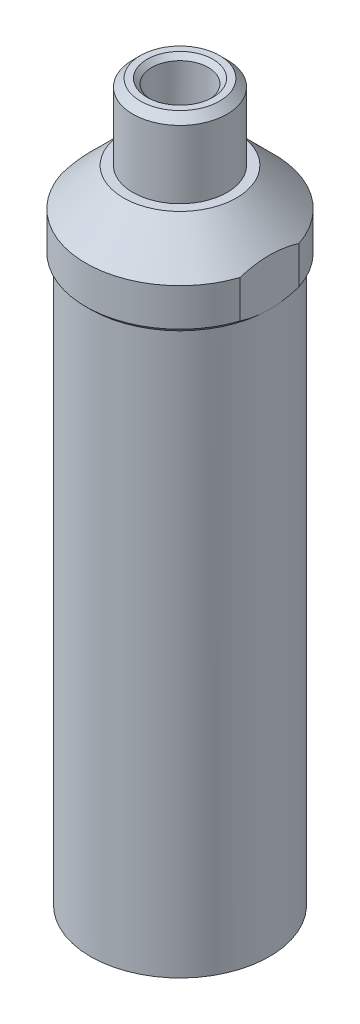
ISO-10303-21;
HEADER;
FILE_DESCRIPTION(('STEP AP214'),'2;1');
FILE_NAME('part.step','',(''),(''),'','','');
FILE_SCHEMA(('AUTOMOTIVE_DESIGN { 1 0 10303 214 1 1 1 1 }'));
ENDSEC;
DATA;
#1=APPLICATION_CONTEXT('core data for automotive mechanical design processes');
#2=APPLICATION_PROTOCOL_DEFINITION('international standard','automotive_design',2000,#1);
#3=PRODUCT_CONTEXT('',#1,'mechanical');
#4=PRODUCT('Part','Part','',(#3));
#5=PRODUCT_RELATED_PRODUCT_CATEGORY('part','',(#4));
#6=PRODUCT_DEFINITION_FORMATION('','',#4);
#7=PRODUCT_DEFINITION_CONTEXT('part definition',#1,'design');
#8=PRODUCT_DEFINITION('design','',#6,#7);
#9=PRODUCT_DEFINITION_SHAPE('','',#8);
#10=(LENGTH_UNIT() NAMED_UNIT(*) SI_UNIT(.MILLI.,.METRE.));
#11=(NAMED_UNIT(*) PLANE_ANGLE_UNIT() SI_UNIT($,.RADIAN.));
#12=(NAMED_UNIT(*) SI_UNIT($,.STERADIAN.) SOLID_ANGLE_UNIT());
#13=UNCERTAINTY_MEASURE_WITH_UNIT(LENGTH_MEASURE(1.E-05),#10,'distance_accuracy_value','');
#14=(GEOMETRIC_REPRESENTATION_CONTEXT(3) GLOBAL_UNCERTAINTY_ASSIGNED_CONTEXT((#13)) GLOBAL_UNIT_ASSIGNED_CONTEXT((#10,
#11,#12)) REPRESENTATION_CONTEXT('',''));
#15=CARTESIAN_POINT('',(0.,0.,0.));
#16=DIRECTION('',(0.,0.,1.));
#17=DIRECTION('',(1.,0.,0.));
#18=AXIS2_PLACEMENT_3D('',#15,#16,#17);
#19=CARTESIAN_POINT('',(0.,21.5,0.));
#20=DIRECTION('',(0.,1.,0.));
#21=DIRECTION('',(0.,0.,1.));
#22=AXIS2_PLACEMENT_3D('',#19,#20,#21);
#23=CONICAL_SURFACE('',#22,9.5,0.785398163397453);
#24=CARTESIAN_POINT('',(0.,22.,0.));
#25=DIRECTION('',(0.,1.,0.));
#26=DIRECTION('',(0.,0.,1.));
#27=AXIS2_PLACEMENT_3D('',#24,#25,#26);
#28=CIRCLE('',#27,9.99999999999999);
#29=CARTESIAN_POINT('',(-9.49999999999999,22.,3.12249899919922));
#30=VERTEX_POINT('',#29);
#31=CARTESIAN_POINT('',(9.50000000000001,22.,3.12249899919915));
#32=VERTEX_POINT('',#31);
#33=EDGE_CURVE('E102',#30,#32,#28,.T.);
#34=ORIENTED_EDGE('',*,*,#33,.F.);
#35=CARTESIAN_POINT('',(-9.49999999999999,23.7655426761476,-6.94103698767337));
#36=CARTESIAN_POINT('',(-9.49999999999999,23.6633875734474,-6.76785319191491));
#37=CARTESIAN_POINT('',(-9.49999999999999,23.5630547194539,-6.59357904189187));
#38=CARTESIAN_POINT('',(-9.49999999999999,23.3665813009803,-6.24262787758601));
#39=CARTESIAN_POINT('',(-9.49999999999999,23.2704418086744,-6.0659502637503));
#40=CARTESIAN_POINT('',(-9.49999999999999,23.0825723210122,-5.70933066390789));
#41=CARTESIAN_POINT('',(-9.49999999999999,22.9908619517676,-5.52937828804054));
#42=CARTESIAN_POINT('',(-9.49999999999999,22.8129846247096,-5.16677641978011));
#43=CARTESIAN_POINT('',(-9.49999999999999,22.7268172929149,-4.98412711037));
#44=CARTESIAN_POINT('',(-9.49999999999999,22.4749061412648,-4.42555531792213));
#45=CARTESIAN_POINT('',(-9.49999999999999,22.3190164959829,-4.04508757595159));
#46=CARTESIAN_POINT('',(-9.49999999999999,22.0413526862449,-3.27233239436959));
#47=CARTESIAN_POINT('',(-9.49999999999999,21.9195204235351,-2.88006636361972));
#48=CARTESIAN_POINT('',(-9.49999999999999,21.7591895241239,-2.24593021535189));
#49=CARTESIAN_POINT('',(-9.49999999999999,21.7069271307876,-2.00752195315215));
#50=CARTESIAN_POINT('',(-9.49999999999999,21.6191428321394,-1.52758486397119));
#51=CARTESIAN_POINT('',(-9.49999999999999,21.5836217373669,-1.28605588648035));
#52=CARTESIAN_POINT('',(-9.49999999999999,21.530889302188,-0.803091516434461));
#53=CARTESIAN_POINT('',(-9.49999999999999,21.5135230284213,-0.561673204705952));
#54=CARTESIAN_POINT('',(-9.49999999999999,21.4972488879126,-0.0782087026926604));
#55=CARTESIAN_POINT('',(-9.49999999999999,21.4983414366723,0.163837501603142));
#56=CARTESIAN_POINT('',(-9.49999999999999,21.5205939399293,0.685486007498382));
#57=CARTESIAN_POINT('',(-9.49999999999999,21.544908693273,0.964957100448584));
#58=CARTESIAN_POINT('',(-9.49999999999999,21.6170133346928,1.52085380182359));
#59=CARTESIAN_POINT('',(-9.49999999999999,21.6648079785895,1.79727878166003));
#60=CARTESIAN_POINT('',(-9.49999999999999,21.7823429499146,2.34900771849833));
#61=CARTESIAN_POINT('',(-9.49999999999999,21.8523519491966,2.62425376510481));
#62=CARTESIAN_POINT('',(-9.49999999999999,22.0112587166644,3.16910697958628));
#63=CARTESIAN_POINT('',(-9.49999999999999,22.1001527772134,3.43871524291131));
#64=CARTESIAN_POINT('',(-9.49999999999999,22.318745538043,4.04028691436915));
#65=CARTESIAN_POINT('',(-9.49999999999999,22.4530655757154,4.37056210967586));
#66=CARTESIAN_POINT('',(-9.49999999999999,22.7418637798665,5.02225591606412));
#67=CARTESIAN_POINT('',(-9.49999999999999,22.8963524093736,5.34366982454646));
#68=CARTESIAN_POINT('',(-9.49999999999999,23.221783079405,5.97940035732117));
#69=CARTESIAN_POINT('',(-9.49999999999998,23.3927803209317,6.29368850342107));
#70=CARTESIAN_POINT('',(-9.49999999999998,23.7473972300559,6.91493811336033));
#71=CARTESIAN_POINT('',(-9.49999999999998,23.9310146627368,7.22190086155335));
#72=CARTESIAN_POINT('',(-9.49999999999998,24.2996898474862,7.81562428351678));
#73=CARTESIAN_POINT('',(-9.49999999999998,24.4842966949386,8.10266641258412));
#74=CARTESIAN_POINT('',(-9.49999999999998,24.8609867597827,8.67181997026174));
#75=CARTESIAN_POINT('',(-9.49999999999998,25.053070580257,8.95393099846566));
#76=CARTESIAN_POINT('',(-9.49999999999998,25.4416910694492,9.51150689075399));
#77=CARTESIAN_POINT('',(-9.49999999999998,25.6381761670032,9.78700782715536));
#78=CARTESIAN_POINT('',(-9.49999999999998,26.0361154600087,10.3342848089129));
#79=CARTESIAN_POINT('',(-9.49999999999998,26.2375682632306,10.6060618654269));
#80=CARTESIAN_POINT('',(-9.49999999999998,26.4410421162138,10.8762906085789));
#81=B_SPLINE_CURVE_WITH_KNOTS('',3,(#35,#36,#37,#38,#39,#40,#41,#42,#43,#44,#45,#46,#47,#48,#49,
#50,#51,#52,#53,#54,#55,#56,#57,#58,#59,#60,#61,#62,#63,#64,#65,#66,#67,#68,#69,#70,#71,#72,#73,
#74,#75,#76,#77,#78,#79,#80),.UNSPECIFIED.,.F.,.F.,(4,2,2,2,2,2,2,2,2,2,2,2,2,2,2,2,2,2,2,2,2,2,
4),(0.,0.603211379245785,1.2065760963789,1.8124066054361,2.41819619695984,3.65043330144721,
4.88055533187105,5.61225188600817,6.34398386200068,7.06941894862239,7.79487036455387,
8.63536330105207,9.47602654851139,10.3272717820731,11.1783500478813,12.2471026980724,
13.3164120137394,14.3894295975903,15.4622576473595,16.4859634103769,17.5097519159235,
18.5248589357587,19.5396846283297),.UNSPECIFIED.);
#82=CARTESIAN_POINT('',(-9.49999999999999,21.5,0.));
#83=VERTEX_POINT('',#82);
#84=EDGE_CURVE('E164',#30,#83,#81,.F.);
#85=ORIENTED_EDGE('',*,*,#84,.T.);
#86=CARTESIAN_POINT('',(0.,21.5,0.));
#87=DIRECTION('',(0.,1.,0.));
#88=DIRECTION('',(0.,0.,1.));
#89=AXIS2_PLACEMENT_3D('',#86,#87,#88);
#90=CIRCLE('',#89,9.5);
#91=CARTESIAN_POINT('',(9.50000000000001,21.5,0.));
#92=VERTEX_POINT('',#91);
#93=EDGE_CURVE('E110',#83,#92,#90,.T.);
#94=ORIENTED_EDGE('',*,*,#93,.T.);
#95=CARTESIAN_POINT('',(9.50000000000001,23.7655426761476,-6.94103698767337));
#96=CARTESIAN_POINT('',(9.50000000000001,23.6633875734474,-6.76785319191491));
#97=CARTESIAN_POINT('',(9.50000000000001,23.5630547194539,-6.59357904189187));
#98=CARTESIAN_POINT('',(9.50000000000001,23.3665813009803,-6.242627877586));
#99=CARTESIAN_POINT('',(9.50000000000001,23.2704418086744,-6.0659502637503));
#100=CARTESIAN_POINT('',(9.50000000000001,23.0825723210122,-5.70933066390788));
#101=CARTESIAN_POINT('',(9.50000000000001,22.9908619517676,-5.52937828804054));
#102=CARTESIAN_POINT('',(9.50000000000001,22.8129846247096,-5.16677641978011));
#103=CARTESIAN_POINT('',(9.50000000000001,22.7268172929149,-4.98412711036999));
#104=CARTESIAN_POINT('',(9.50000000000001,22.4749061412648,-4.42555531792213));
#105=CARTESIAN_POINT('',(9.50000000000001,22.3190164959829,-4.04508757595159));
#106=CARTESIAN_POINT('',(9.50000000000001,22.0413526862449,-3.27233239436958));
#107=CARTESIAN_POINT('',(9.50000000000001,21.9195204235352,-2.88006636361972));
#108=CARTESIAN_POINT('',(9.50000000000001,21.7591895241239,-2.24593021535189));
#109=CARTESIAN_POINT('',(9.50000000000001,21.7069271307876,-2.00752195315215));
#110=CARTESIAN_POINT('',(9.50000000000001,21.6191428321394,-1.52758486397119));
#111=CARTESIAN_POINT('',(9.50000000000001,21.5836217373669,-1.28605588648034));
#112=CARTESIAN_POINT('',(9.50000000000001,21.530889302188,-0.803091516434452));
#113=CARTESIAN_POINT('',(9.50000000000001,21.5135230284213,-0.561673204705943));
#114=CARTESIAN_POINT('',(9.50000000000001,21.4972488879126,-0.0782087026926514));
#115=CARTESIAN_POINT('',(9.50000000000001,21.4983414366723,0.163837501603151));
#116=CARTESIAN_POINT('',(9.50000000000001,21.5205939399293,0.685486007498391));
#117=CARTESIAN_POINT('',(9.50000000000001,21.544908693273,0.964957100448594));
#118=CARTESIAN_POINT('',(9.50000000000001,21.6170133346928,1.5208538018236));
#119=CARTESIAN_POINT('',(9.50000000000001,21.6648079785895,1.79727878166004));
#120=CARTESIAN_POINT('',(9.50000000000001,21.7823429499146,2.34900771849835));
#121=CARTESIAN_POINT('',(9.50000000000001,21.8523519491966,2.62425376510482));
#122=CARTESIAN_POINT('',(9.50000000000001,22.0112587166644,3.16910697958629));
#123=CARTESIAN_POINT('',(9.50000000000001,22.1001527772135,3.43871524291133));
#124=CARTESIAN_POINT('',(9.50000000000001,22.3187455380431,4.04028691436917));
#125=CARTESIAN_POINT('',(9.50000000000001,22.4530655757155,4.37056210967588));
#126=CARTESIAN_POINT('',(9.50000000000001,22.7418637798666,5.02225591606414));
#127=CARTESIAN_POINT('',(9.50000000000001,22.8963524093737,5.34366982454648));
#128=CARTESIAN_POINT('',(9.50000000000001,23.221783079405,5.9794003573212));
#129=CARTESIAN_POINT('',(9.50000000000001,23.3927803209318,6.2936885034211));
#130=CARTESIAN_POINT('',(9.50000000000001,23.7473972300559,6.91493811336036));
#131=CARTESIAN_POINT('',(9.50000000000001,23.9310146627368,7.22190086155338));
#132=CARTESIAN_POINT('',(9.50000000000001,24.2996898474862,7.81562428351682));
#133=CARTESIAN_POINT('',(9.50000000000001,24.4842966949386,8.10266641258416));
#134=CARTESIAN_POINT('',(9.50000000000001,24.8609867597827,8.67181997026178));
#135=CARTESIAN_POINT('',(9.50000000000001,25.0530705802571,8.9539309984657));
#136=CARTESIAN_POINT('',(9.50000000000001,25.4416910694492,9.51150689075404));
#137=CARTESIAN_POINT('',(9.50000000000001,25.6381761670032,9.7870078271554));
#138=CARTESIAN_POINT('',(9.50000000000001,26.0361154600088,10.334284808913));
#139=CARTESIAN_POINT('',(9.50000000000001,26.2375682632306,10.6060618654269));
#140=CARTESIAN_POINT('',(9.50000000000001,26.4410421162138,10.8762906085789));
#141=B_SPLINE_CURVE_WITH_KNOTS('',3,(#95,#96,#97,#98,#99,#100,#101,#102,#103,#104,#105,#106,
#107,#108,#109,#110,#111,#112,#113,#114,#115,#116,#117,#118,#119,#120,#121,#122,#123,#124,#125,
#126,#127,#128,#129,#130,#131,#132,#133,#134,#135,#136,#137,#138,#139,#140),.UNSPECIFIED.,.F.,
.F.,(4,2,2,2,2,2,2,2,2,2,2,2,2,2,2,2,2,2,2,2,2,2,4),(0.,0.603211379245786,1.2065760963789,
1.8124066054361,2.41819619695984,3.65043330144721,4.88055533187105,5.61225188600817,
6.34398386200068,7.0694189486224,7.79487036455387,8.63536330105208,9.47602654851139,
10.3272717820732,11.1783500478813,12.2471026980724,13.3164120137394,14.3894295975903,
15.4622576473595,16.4859634103769,17.5097519159236,18.5248589357588,19.5396846283297),.UNSPECIFIED.);
#142=EDGE_CURVE('E153',#92,#32,#141,.T.);
#143=ORIENTED_EDGE('',*,*,#142,.T.);
#144=EDGE_LOOP('',(#34,#85,#94,#143));
#145=FACE_BOUND('',#144,.T.);
#146=ADVANCED_FACE('F37',(#145),#23,.T.);
#147=CARTESIAN_POINT('',(0.,40.4226825888373,0.));
#148=DIRECTION('',(0.,1.,0.));
#149=DIRECTION('',(0.,0.,1.));
#150=AXIS2_PLACEMENT_3D('',#147,#148,#149);
#151=CYLINDRICAL_SURFACE('',#150,9.99999999999999);
#152=CARTESIAN_POINT('',(9.50000000000001,22.,-3.12249899919917));
#153=VERTEX_POINT('',#152);
#154=CARTESIAN_POINT('',(-9.49999999999999,22.,-3.12249899919923));
#155=VERTEX_POINT('',#154);
#156=EDGE_CURVE('E98',#153,#155,#28,.T.);
#157=ORIENTED_EDGE('',*,*,#156,.T.);
#158=DIRECTION('',(0.,1.,0.));
#159=VECTOR('',#158,1.);
#160=CARTESIAN_POINT('',(-9.49999999999999,40.4226825888373,-3.12249899919923));
#161=LINE('',#160,#159);
#162=CARTESIAN_POINT('',(-9.49999999999999,26.,-3.12249899919923));
#163=VERTEX_POINT('',#162);
#164=EDGE_CURVE('E85',#155,#163,#161,.T.);
#165=ORIENTED_EDGE('',*,*,#164,.T.);
#166=CARTESIAN_POINT('',(0.,26.,0.));
#167=DIRECTION('',(0.,1.,0.));
#168=DIRECTION('',(0.,0.,1.));
#169=AXIS2_PLACEMENT_3D('',#166,#167,#168);
#170=CIRCLE('',#169,9.99999999999999);
#171=CARTESIAN_POINT('',(9.50000000000001,26.,-3.12249899919917));
#172=VERTEX_POINT('',#171);
#173=EDGE_CURVE('E96',#172,#163,#170,.T.);
#174=ORIENTED_EDGE('',*,*,#173,.F.);
#175=DIRECTION('',(0.,1.,0.));
#176=VECTOR('',#175,1.);
#177=CARTESIAN_POINT('',(9.50000000000001,40.4226825888373,-3.12249899919917));
#178=LINE('',#177,#176);
#179=EDGE_CURVE('E60',#172,#153,#178,.F.);
#180=ORIENTED_EDGE('',*,*,#179,.T.);
#181=EDGE_LOOP('',(#157,#165,#174,#180));
#182=FACE_BOUND('',#181,.T.);
#183=ADVANCED_FACE('F95',(#182),#151,.T.);
#184=CARTESIAN_POINT('',(0.,38.,-4.2));
#185=DIRECTION('',(0.,-1.,0.));
#186=DIRECTION('',(0.,0.,-1.));
#187=AXIS2_PLACEMENT_3D('',#184,#185,#186);
#188=PLANE('',#187);
#189=CARTESIAN_POINT('',(0.,38.,0.));
#190=DIRECTION('',(0.,-1.,0.));
#191=DIRECTION('',(0.,0.,-1.));
#192=AXIS2_PLACEMENT_3D('',#189,#190,#191);
#193=CIRCLE('',#192,3.50000000000001);
#194=CARTESIAN_POINT('',(0.,38.,-3.50000000000002));
#195=VERTEX_POINT('',#194);
#196=EDGE_CURVE('E11',#195,#195,#193,.T.);
#197=ORIENTED_EDGE('',*,*,#196,.T.);
#198=EDGE_LOOP('',(#197));
#199=FACE_BOUND('',#198,.T.);
#200=CARTESIAN_POINT('',(0.,38.,0.));
#201=DIRECTION('',(0.,1.,0.));
#202=DIRECTION('',(0.,0.,1.));
#203=AXIS2_PLACEMENT_3D('',#200,#201,#202);
#204=CIRCLE('',#203,4.19999999999999);
#205=CARTESIAN_POINT('',(0.,38.,4.19999999999998));
#206=VERTEX_POINT('',#205);
#207=EDGE_CURVE('E219',#206,#206,#204,.T.);
#208=ORIENTED_EDGE('',*,*,#207,.T.);
#209=EDGE_LOOP('',(#208));
#210=FACE_BOUND('',#209,.T.);
#211=ADVANCED_FACE('F180',(#199,#210),#188,.F.);
#212=CARTESIAN_POINT('',(0.,40.4226825888373,0.));
#213=DIRECTION('',(0.,1.,0.));
#214=DIRECTION('',(0.,0.,1.));
#215=AXIS2_PLACEMENT_3D('',#212,#213,#214);
#216=CYLINDRICAL_SURFACE('',#215,3.);
#217=CARTESIAN_POINT('',(0.,37.5,0.));
#218=DIRECTION('',(0.,-1.,0.));
#219=DIRECTION('',(0.,0.,-1.));
#220=AXIS2_PLACEMENT_3D('',#217,#218,#219);
#221=CIRCLE('',#220,3.);
#222=CARTESIAN_POINT('',(0.,37.5,-3.00000000000001));
#223=VERTEX_POINT('',#222);
#224=EDGE_CURVE('E45',#223,#223,#221,.F.);
#225=ORIENTED_EDGE('',*,*,#224,.T.);
#226=EDGE_LOOP('',(#225));
#227=FACE_BOUND('',#226,.T.);
#228=CARTESIAN_POINT('',(0.,-38.,0.));
#229=DIRECTION('',(0.,1.,0.));
#230=DIRECTION('',(0.,0.,1.));
#231=AXIS2_PLACEMENT_3D('',#228,#229,#230);
#232=CIRCLE('',#231,3.00000000000001);
#233=CARTESIAN_POINT('',(0.,-38.,3.00000000000001));
#234=VERTEX_POINT('',#233);
#235=EDGE_CURVE('E117',#234,#234,#232,.T.);
#236=ORIENTED_EDGE('',*,*,#235,.F.);
#237=EDGE_LOOP('',(#236));
#238=FACE_BOUND('',#237,.T.);
#239=ADVANCED_FACE('F200',(#227,#238),#216,.F.);
#240=CARTESIAN_POINT('',(0.,-38.,-3.00000000000001));
#241=DIRECTION('',(0.,1.,0.));
#242=DIRECTION('',(0.,0.,1.));
#243=AXIS2_PLACEMENT_3D('',#240,#241,#242);
#244=PLANE('',#243);
#245=CARTESIAN_POINT('',(0.,-38.,0.));
#246=DIRECTION('',(0.,1.,0.));
#247=DIRECTION('',(0.,0.,1.));
#248=AXIS2_PLACEMENT_3D('',#245,#246,#247);
#249=CIRCLE('',#248,9.50000000000001);
#250=CARTESIAN_POINT('',(0.,-38.,9.50000000000001));
#251=VERTEX_POINT('',#250);
#252=EDGE_CURVE('E114',#251,#251,#249,.T.);
#253=ORIENTED_EDGE('',*,*,#252,.F.);
#254=EDGE_LOOP('',(#253));
#255=FACE_BOUND('',#254,.T.);
#256=ORIENTED_EDGE('',*,*,#235,.T.);
#257=EDGE_LOOP('',(#256));
#258=FACE_BOUND('',#257,.T.);
#259=ADVANCED_FACE('F195',(#255,#258),#244,.F.);
#260=CARTESIAN_POINT('',(0.,40.4226825888373,0.));
#261=DIRECTION('',(0.,1.,0.));
#262=DIRECTION('',(0.,0.,1.));
#263=AXIS2_PLACEMENT_3D('',#260,#261,#262);
#264=CYLINDRICAL_SURFACE('',#263,9.50000000000001);
#265=ORIENTED_EDGE('',*,*,#93,.F.);
#266=EDGE_CURVE('E111',#92,#83,#90,.T.);
#267=ORIENTED_EDGE('',*,*,#266,.F.);
#268=EDGE_LOOP('',(#265,#267));
#269=FACE_BOUND('',#268,.T.);
#270=ORIENTED_EDGE('',*,*,#252,.T.);
#271=EDGE_LOOP('',(#270));
#272=FACE_BOUND('',#271,.T.);
#273=ADVANCED_FACE('F148',(#269,#272),#264,.T.);
#274=ORIENTED_EDGE('',*,*,#266,.T.);
#275=EDGE_CURVE('E99',#83,#155,#81,.F.);
#276=ORIENTED_EDGE('',*,*,#275,.T.);
#277=ORIENTED_EDGE('',*,*,#156,.F.);
#278=EDGE_CURVE('E190',#153,#92,#141,.T.);
#279=ORIENTED_EDGE('',*,*,#278,.T.);
#280=EDGE_LOOP('',(#274,#276,#277,#279));
#281=FACE_BOUND('',#280,.T.);
#282=ADVANCED_FACE('F143',(#281),#23,.T.);
#283=CARTESIAN_POINT('',(-9.49999999999999,26.,3.12249899919922));
#284=VERTEX_POINT('',#283);
#285=CARTESIAN_POINT('',(9.50000000000001,26.,3.12249899919915));
#286=VERTEX_POINT('',#285);
#287=EDGE_CURVE('E103',#284,#286,#170,.T.);
#288=ORIENTED_EDGE('',*,*,#287,.F.);
#289=DIRECTION('',(0.,1.,0.));
#290=VECTOR('',#289,1.);
#291=CARTESIAN_POINT('',(-9.49999999999999,40.4226825888373,3.12249899919922));
#292=LINE('',#291,#290);
#293=EDGE_CURVE('E52',#284,#30,#292,.F.);
#294=ORIENTED_EDGE('',*,*,#293,.T.);
#295=ORIENTED_EDGE('',*,*,#33,.T.);
#296=DIRECTION('',(0.,1.,0.));
#297=VECTOR('',#296,1.);
#298=CARTESIAN_POINT('',(9.50000000000001,40.4226825888373,3.12249899919915));
#299=LINE('',#298,#297);
#300=EDGE_CURVE('E188',#32,#286,#299,.T.);
#301=ORIENTED_EDGE('',*,*,#300,.T.);
#302=EDGE_LOOP('',(#288,#294,#295,#301));
#303=FACE_BOUND('',#302,.T.);
#304=ADVANCED_FACE('F137',(#303),#151,.T.);
#305=CARTESIAN_POINT('',(0.,26.,0.));
#306=DIRECTION('',(0.,-1.,0.));
#307=DIRECTION('',(0.,0.,-1.));
#308=AXIS2_PLACEMENT_3D('',#305,#306,#307);
#309=CONICAL_SURFACE('',#308,9.99999999999999,0.785398163397444);
#310=CARTESIAN_POINT('',(0.,30.,0.));
#311=DIRECTION('',(0.,1.,0.));
#312=DIRECTION('',(0.,0.,1.));
#313=AXIS2_PLACEMENT_3D('',#310,#311,#312);
#314=CIRCLE('',#313,5.99999999999999);
#315=CARTESIAN_POINT('',(0.,30.,5.99999999999999));
#316=VERTEX_POINT('',#315);
#317=EDGE_CURVE('E106',#316,#316,#314,.T.);
#318=ORIENTED_EDGE('',*,*,#317,.F.);
#319=EDGE_LOOP('',(#318));
#320=FACE_BOUND('',#319,.T.);
#321=ORIENTED_EDGE('',*,*,#173,.T.);
#322=CARTESIAN_POINT('',(-9.49999999999999,3.87633602711858,-30.6868015120928));
#323=CARTESIAN_POINT('',(-9.49999999999999,4.2284232175783,-30.3182262051584));
#324=CARTESIAN_POINT('',(-9.49999999999999,4.58022269725372,-29.9493761187585));
#325=CARTESIAN_POINT('',(-9.49999999999999,5.28317591772293,-29.2110602528687));
#326=CARTESIAN_POINT('',(-9.49999999999999,5.63432965767052,-28.8415944725732));
#327=CARTESIAN_POINT('',(-9.49999999999999,6.68674720319735,-27.7321423215132));
#328=CARTESIAN_POINT('',(-9.49999999999999,7.38693541077023,-26.9911345339041));
#329=CARTESIAN_POINT('',(-9.49999999999999,8.78549521353805,-25.5037938199358));
#330=CARTESIAN_POINT('',(-9.49999999999999,9.48385744226436,-24.7574520819541));
#331=CARTESIAN_POINT('',(-9.49999999999999,10.8758769631771,-23.2604303232548));
#332=CARTESIAN_POINT('',(-9.49999999999999,11.5695344024739,-22.5097504395553));
#333=CARTESIAN_POINT('',(-9.49999999999999,12.6456455441504,-21.3355117393334));
#334=CARTESIAN_POINT('',(-9.49999999999999,13.0302351437804,-20.9139103277225));
#335=CARTESIAN_POINT('',(-9.49999999999999,13.797116946597,-20.0686239907718));
#336=CARTESIAN_POINT('',(-9.49999999999999,14.1794091566417,-19.6449390716583));
#337=CARTESIAN_POINT('',(-9.49999999999999,14.9412975331807,-18.7950634620557));
#338=CARTESIAN_POINT('',(-9.49999999999999,15.3208933884925,-18.3688724923973));
#339=CARTESIAN_POINT('',(-9.49999999999999,16.0767748443185,-17.5135653419108));
#340=CARTESIAN_POINT('',(-9.49999999999999,16.4530604585158,-17.0844491731872));
#341=CARTESIAN_POINT('',(-9.49999999999999,17.2010104365867,-16.2233619070445));
#342=CARTESIAN_POINT('',(-9.49999999999999,17.5726810211332,-15.791396219501));
#343=CARTESIAN_POINT('',(-9.49999999999999,18.311030780027,-14.9231975962009));
#344=CARTESIAN_POINT('',(-9.49999999999999,18.6777098553758,-14.4869645761029));
#345=CARTESIAN_POINT('',(-9.49999999999999,19.404695777801,-13.6093556033075));
#346=CARTESIAN_POINT('',(-9.49999999999999,19.7650038616017,-13.1679806769649));
#347=CARTESIAN_POINT('',(-9.49999999999999,20.4775295922072,-12.2787613823184));
#348=CARTESIAN_POINT('',(-9.49999999999999,20.8297476796712,-11.830917368558));
#349=CARTESIAN_POINT('',(-9.49999999999999,21.4256233210391,-11.0546617645451));
#350=CARTESIAN_POINT('',(-9.49999999999999,21.6718552660725,-10.7282287442109));
#351=CARTESIAN_POINT('',(-9.49999999999999,22.1575751762049,-10.0703526790243));
#352=CARTESIAN_POINT('',(-9.49999999999999,22.3970629376983,-9.73890948337882));
#353=CARTESIAN_POINT('',(-9.49999999999999,22.8680849774382,-9.06939496751325));
#354=CARTESIAN_POINT('',(-9.49999999999999,23.0996021943867,-8.73131160019925));
#355=CARTESIAN_POINT('',(-9.49999999999999,23.5519030128789,-8.04802653523877));
#356=CARTESIAN_POINT('',(-9.49999999999999,23.7726871450189,-7.70282519067763));
#357=CARTESIAN_POINT('',(-9.49999999999999,24.1956857524875,-7.01176411508929));
#358=CARTESIAN_POINT('',(-9.49999999999999,24.3982054102665,-6.66609234531786));
#359=CARTESIAN_POINT('',(-9.49999999999999,24.7862740533627,-5.96513789508896));
#360=CARTESIAN_POINT('',(-9.49999999999999,24.9718184020017,-5.60985262290894));
#361=CARTESIAN_POINT('',(-9.49999999999999,25.3201041719974,-4.88970101579829));
#362=CARTESIAN_POINT('',(-9.49999999999999,25.4829231358801,-4.52487256974944));
#363=CARTESIAN_POINT('',(-9.49999999999999,25.7798090381151,-3.78381429095737));
#364=CARTESIAN_POINT('',(-9.49999999999999,25.9139015334119,-3.40759493533847));
#365=CARTESIAN_POINT('',(-9.49999999999999,26.101392783257,-2.78980328689699));
#366=CARTESIAN_POINT('',(-9.49999999999999,26.1660567835854,-2.55164215180365));
#367=CARTESIAN_POINT('',(-9.49999999999999,26.2795714809073,-2.07150114882499));
#368=CARTESIAN_POINT('',(-9.49999999999999,26.3284201801121,-1.82952080254271));
#369=CARTESIAN_POINT('',(-9.49999999999999,26.4084961763129,-1.34323698389757));
#370=CARTESIAN_POINT('',(-9.49999999999999,26.4397661474995,-1.09894061432714));
#371=CARTESIAN_POINT('',(-9.49999999999999,26.4836522326323,-0.608679454511711));
#372=CARTESIAN_POINT('',(-9.49999999999999,26.4962692190397,-0.362714742841166));
#373=CARTESIAN_POINT('',(-9.49999999999999,26.5028908769195,0.177766678674566));
#374=CARTESIAN_POINT('',(-9.49999999999999,26.4927593464282,0.472343495567641));
#375=CARTESIAN_POINT('',(-9.49999999999999,26.445603178046,1.05932986344403));
#376=CARTESIAN_POINT('',(-9.49999999999999,26.4085743904798,1.35173907297875));
#377=CARTESIAN_POINT('',(-9.49999999999999,26.3095047724,1.93345087381332));
#378=CARTESIAN_POINT('',(-9.49999999999999,26.2473628486655,2.22273599796374));
#379=CARTESIAN_POINT('',(-9.49999999999999,26.1010716111639,2.79563308001634));
#380=CARTESIAN_POINT('',(-9.49999999999999,26.0169204017196,3.07924454697574));
#381=CARTESIAN_POINT('',(-9.49999999999999,25.8253042438655,3.65396278172235));
#382=CARTESIAN_POINT('',(-9.49999999999999,25.7168959916538,3.94475184100114));
#383=CARTESIAN_POINT('',(-9.49999999999999,25.4830380683315,4.51945179220023));
#384=CARTESIAN_POINT('',(-9.49999999999999,25.35758185262,4.80335999303968));
#385=CARTESIAN_POINT('',(-9.49999999999999,25.0925858386158,5.3649866124449));
#386=CARTESIAN_POINT('',(-9.49999999999998,24.9530255814939,5.64269530467187));
#387=CARTESIAN_POINT('',(-9.49999999999998,24.6625788867644,6.19204860149716));
#388=CARTESIAN_POINT('',(-9.49999999999998,24.5116937012692,6.46369387218667));
#389=CARTESIAN_POINT('',(-9.49999999999998,24.1984648588362,7.00540868875611));
#390=CARTESIAN_POINT('',(-9.49999999999998,24.035989344801,7.27540163836355));
#391=CARTESIAN_POINT('',(-9.49999999999998,23.7032359759077,7.81052518260313));
#392=CARTESIAN_POINT('',(-9.49999999999998,23.5329579435435,8.07565566642251));
#393=CARTESIAN_POINT('',(-9.49999999999998,23.186123231692,8.60142011654271));
#394=CARTESIAN_POINT('',(-9.49999999999998,23.0095723793485,8.86205793840075));
#395=CARTESIAN_POINT('',(-9.49999999999998,22.6511320177323,9.37961119855523));
#396=CARTESIAN_POINT('',(-9.49999999999998,22.4692427251823,9.63652678733114));
#397=CARTESIAN_POINT('',(-9.49999999999998,22.0725535213177,10.1865331078574));
#398=CARTESIAN_POINT('',(-9.49999999999998,21.857007958826,10.4790852762168));
#399=CARTESIAN_POINT('',(-9.49999999999998,21.4209855940597,11.0604981540113));
#400=CARTESIAN_POINT('',(-9.49999999999998,21.2005086216675,11.3493587355568));
#401=CARTESIAN_POINT('',(-9.49999999999998,20.755418635204,11.9239372707384));
#402=CARTESIAN_POINT('',(-9.49999999999998,20.5308050329964,12.2096547681286));
#403=CARTESIAN_POINT('',(-9.49999999999998,20.0781172105557,12.7783376024075));
#404=CARTESIAN_POINT('',(-9.49999999999998,19.8500429367759,13.0613028966002));
#405=CARTESIAN_POINT('',(-9.49999999999998,19.1611788197225,13.9069496406085));
#406=CARTESIAN_POINT('',(-9.49999999999998,18.6960009894499,14.4660574788229));
#407=CARTESIAN_POINT('',(-9.49999999999998,17.757098165817,15.576947692253));
#408=CARTESIAN_POINT('',(-9.49999999999998,17.2833737936967,16.1287305948907));
#409=CARTESIAN_POINT('',(-9.49999999999998,16.3281890291549,17.2280094918533));
#410=CARTESIAN_POINT('',(-9.49999999999998,15.8467120647856,17.7754910658173));
#411=CARTESIAN_POINT('',(-9.49999999999998,14.8786648730957,18.8659405235666));
#412=CARTESIAN_POINT('',(-9.49999999999998,14.392094565324,19.4089083358117));
#413=CARTESIAN_POINT('',(-9.49999999999998,13.4150936689082,20.4910241425985));
#414=CARTESIAN_POINT('',(-9.49999999999998,12.9246644359844,21.0301733623805));
#415=CARTESIAN_POINT('',(-9.49999999999998,11.9405678247588,22.1055001554287));
#416=CARTESIAN_POINT('',(-9.49999999999998,11.4469004642604,22.6416777450034));
#417=CARTESIAN_POINT('',(-9.49999999999998,10.0820856156823,24.1167151761043));
#418=CARTESIAN_POINT('',(-9.49999999999998,9.20818875553686,25.0530305755213));
#419=CARTESIAN_POINT('',(-9.49999999999998,7.45446273443011,26.9202523698047));
#420=CARTESIAN_POINT('',(-9.49999999999998,6.57463299713349,27.8511582223313));
#421=CARTESIAN_POINT('',(-9.49999999999998,4.81467045900056,29.7045238393135));
#422=CARTESIAN_POINT('',(-9.49999999999998,3.93455781556473,30.627002755472));
#423=CARTESIAN_POINT('',(-9.49999999999998,2.61194452282567,32.0082764507213));
#424=CARTESIAN_POINT('',(-9.49999999999998,2.1706914899177,32.4682671794338));
#425=CARTESIAN_POINT('',(-9.49999999999998,1.2874458253923,33.3875369708993));
#426=CARTESIAN_POINT('',(-9.49999999999998,0.845453194693528,33.846816034535));
#427=CARTESIAN_POINT('',(-9.49999999999998,0.403136162483057,34.3057825310355));
#428=B_SPLINE_CURVE_WITH_KNOTS('',3,(#322,#323,#324,#325,#326,#327,#328,#329,#330,#331,#332,
#333,#334,#335,#336,#337,#338,#339,#340,#341,#342,#343,#344,#345,#346,#347,#348,#349,#350,#351,
#352,#353,#354,#355,#356,#357,#358,#359,#360,#361,#362,#363,#364,#365,#366,#367,#368,#369,#370,
#371,#372,#373,#374,#375,#376,#377,#378,#379,#380,#381,#382,#383,#384,#385,#386,#387,#388,#389,
#390,#391,#392,#393,#394,#395,#396,#397,#398,#399,#400,#401,#402,#403,#404,#405,#406,#407,#408,
#409,#410,#411,#412,#413,#414,#415,#416,#417,#418,#419,#420,#421,#422,#423,#424,#425,#426,#427),
.UNSPECIFIED.,.F.,.F.,(4,2,2,2,2,2,2,2,2,2,2,2,2,2,2,2,2,2,2,2,2,2,2,2,2,2,2,2,2,2,2,2,2,2,2,2,
2,2,2,2,2,2,2,2,2,2,2,2,2,2,2,2,4),(0.,1.52915574447619,3.05831349140581,6.11676757784315,
9.1831231037507,12.2493823040947,13.9613663613577,15.6733453055936,17.3855187173491,
19.0976850483226,20.8072164497009,22.5167817075818,24.2260113818177,25.9351477330972,
27.1617413488394,28.388371955626,29.6174828387884,30.8465328982198,32.0480518420522,
33.2498979980261,34.4475374018975,35.6441068414152,36.3840029578462,37.1239925015166,
37.8621777990866,38.6003285682174,39.4832663599911,40.3663403992484,41.2530052472374,
42.1397464895335,43.0701134915199,44.0008386696333,44.9329338502439,45.8649261274404,
46.8100970650545,47.7552895158638,48.6996257774044,49.6439237549406,50.7340060729275,
51.8241260534044,52.9144022398057,54.0046953132085,56.1865161115124,58.3681789492341,
60.5553745092241,62.742604669004,64.9290979691086,67.1155792577867,70.9578619973189,
74.8005235235227,78.6254420683535,80.5376813569188,82.4499182720413),.UNSPECIFIED.);
#429=EDGE_CURVE('E82',#163,#284,#428,.T.);
#430=ORIENTED_EDGE('',*,*,#429,.T.);
#431=ORIENTED_EDGE('',*,*,#287,.T.);
#432=CARTESIAN_POINT('',(9.5,3.87633602711865,-30.6868015120928));
#433=CARTESIAN_POINT('',(9.5,4.22842321757836,-30.3182262051583));
#434=CARTESIAN_POINT('',(9.5,4.58022269725378,-29.9493761187584));
#435=CARTESIAN_POINT('',(9.5,5.28317591772298,-29.2110602528687));
#436=CARTESIAN_POINT('',(9.5,5.63432965767057,-28.8415944725731));
#437=CARTESIAN_POINT('',(9.5,6.68674720319739,-27.7321423215132));
#438=CARTESIAN_POINT('',(9.5,7.38693541077027,-26.991134533904));
#439=CARTESIAN_POINT('',(9.5,8.78549521353809,-25.5037938199357));
#440=CARTESIAN_POINT('',(9.5,9.48385744226439,-24.757452081954));
#441=CARTESIAN_POINT('',(9.5,10.8758769631771,-23.2604303232548));
#442=CARTESIAN_POINT('',(9.5,11.5695344024739,-22.5097504395552));
#443=CARTESIAN_POINT('',(9.5,12.6456455441504,-21.3355117393334));
#444=CARTESIAN_POINT('',(9.5,13.0302351437804,-20.9139103277225));
#445=CARTESIAN_POINT('',(9.5,13.797116946597,-20.0686239907717));
#446=CARTESIAN_POINT('',(9.5,14.1794091566417,-19.6449390716583));
#447=CARTESIAN_POINT('',(9.5,14.9412975331807,-18.7950634620557));
#448=CARTESIAN_POINT('',(9.5,15.3208933884926,-18.3688724923973));
#449=CARTESIAN_POINT('',(9.5,16.0767748443185,-17.5135653419107));
#450=CARTESIAN_POINT('',(9.50000000000001,16.4530604585158,-17.0844491731872));
#451=CARTESIAN_POINT('',(9.50000000000001,17.2010104365867,-16.2233619070444));
#452=CARTESIAN_POINT('',(9.50000000000001,17.5726810211332,-15.7913962195009));
#453=CARTESIAN_POINT('',(9.50000000000001,18.311030780027,-14.9231975962009));
#454=CARTESIAN_POINT('',(9.50000000000001,18.6777098553758,-14.4869645761029));
#455=CARTESIAN_POINT('',(9.50000000000001,19.404695777801,-13.6093556033075));
#456=CARTESIAN_POINT('',(9.50000000000001,19.7650038616017,-13.1679806769649));
#457=CARTESIAN_POINT('',(9.50000000000001,20.4775295922072,-12.2787613823184));
#458=CARTESIAN_POINT('',(9.50000000000001,20.8297476796712,-11.830917368558));
#459=CARTESIAN_POINT('',(9.50000000000001,21.4256233210391,-11.0546617645451));
#460=CARTESIAN_POINT('',(9.50000000000001,21.6718552660725,-10.7282287442109));
#461=CARTESIAN_POINT('',(9.50000000000001,22.1575751762049,-10.0703526790243));
#462=CARTESIAN_POINT('',(9.50000000000001,22.3970629376983,-9.73890948337882));
#463=CARTESIAN_POINT('',(9.50000000000001,22.8680849774382,-9.06939496751324));
#464=CARTESIAN_POINT('',(9.50000000000001,23.0996021943867,-8.73131160019924));
#465=CARTESIAN_POINT('',(9.50000000000001,23.5519030128789,-8.04802653523877));
#466=CARTESIAN_POINT('',(9.50000000000001,23.7726871450189,-7.70282519067762));
#467=CARTESIAN_POINT('',(9.50000000000001,24.1956857524875,-7.01176411508928));
#468=CARTESIAN_POINT('',(9.50000000000001,24.3982054102664,-6.66609234531786));
#469=CARTESIAN_POINT('',(9.50000000000001,24.7862740533627,-5.96513789508896));
#470=CARTESIAN_POINT('',(9.50000000000001,24.9718184020017,-5.60985262290894));
#471=CARTESIAN_POINT('',(9.50000000000001,25.3201041719974,-4.88970101579828));
#472=CARTESIAN_POINT('',(9.50000000000001,25.48292313588,-4.52487256974943));
#473=CARTESIAN_POINT('',(9.50000000000001,25.7798090381151,-3.78381429095737));
#474=CARTESIAN_POINT('',(9.50000000000001,25.9139015334119,-3.40759493533847));
#475=CARTESIAN_POINT('',(9.50000000000001,26.1013927832569,-2.78980328689699));
#476=CARTESIAN_POINT('',(9.50000000000001,26.1660567835854,-2.55164215180364));
#477=CARTESIAN_POINT('',(9.50000000000001,26.2795714809073,-2.07150114882498));
#478=CARTESIAN_POINT('',(9.50000000000001,26.3284201801121,-1.82952080254271));
#479=CARTESIAN_POINT('',(9.50000000000001,26.4084961763128,-1.34323698389756));
#480=CARTESIAN_POINT('',(9.50000000000001,26.4397661474995,-1.09894061432714));
#481=CARTESIAN_POINT('',(9.50000000000001,26.4836522326322,-0.6086794545117));
#482=CARTESIAN_POINT('',(9.50000000000001,26.4962692190396,-0.362714742841156));
#483=CARTESIAN_POINT('',(9.50000000000001,26.5028908769195,0.177766678674574));
#484=CARTESIAN_POINT('',(9.50000000000001,26.4927593464282,0.472343495567646));
#485=CARTESIAN_POINT('',(9.50000000000001,26.445603178046,1.05932986344404));
#486=CARTESIAN_POINT('',(9.50000000000001,26.4085743904798,1.35173907297876));
#487=CARTESIAN_POINT('',(9.50000000000001,26.3095047723999,1.93345087381333));
#488=CARTESIAN_POINT('',(9.50000000000001,26.2473628486655,2.22273599796375));
#489=CARTESIAN_POINT('',(9.50000000000001,26.1010716111639,2.79563308001635));
#490=CARTESIAN_POINT('',(9.50000000000001,26.0169204017196,3.07924454697576));
#491=CARTESIAN_POINT('',(9.50000000000001,25.8253042438654,3.65396278172237));
#492=CARTESIAN_POINT('',(9.50000000000001,25.7168959916538,3.94475184100116));
#493=CARTESIAN_POINT('',(9.50000000000001,25.4830380683315,4.51945179220025));
#494=CARTESIAN_POINT('',(9.50000000000001,25.3575818526199,4.80335999303971));
#495=CARTESIAN_POINT('',(9.50000000000001,25.0925858386157,5.36498661244493));
#496=CARTESIAN_POINT('',(9.50000000000001,24.9530255814939,5.6426953046719));
#497=CARTESIAN_POINT('',(9.50000000000001,24.6625788867643,6.19204860149718));
#498=CARTESIAN_POINT('',(9.50000000000001,24.5116937012692,6.4636938721867));
#499=CARTESIAN_POINT('',(9.50000000000001,24.1984648588361,7.00540868875614));
#500=CARTESIAN_POINT('',(9.50000000000001,24.0359893448009,7.27540163836358));
#501=CARTESIAN_POINT('',(9.50000000000001,23.7032359759077,7.81052518260316));
#502=CARTESIAN_POINT('',(9.50000000000001,23.5329579435435,8.07565566642255));
#503=CARTESIAN_POINT('',(9.50000000000001,23.186123231692,8.60142011654275));
#504=CARTESIAN_POINT('',(9.50000000000001,23.0095723793485,8.86205793840078));
#505=CARTESIAN_POINT('',(9.50000000000001,22.6511320177322,9.37961119855527));
#506=CARTESIAN_POINT('',(9.50000000000001,22.4692427251822,9.63652678733118));
#507=CARTESIAN_POINT('',(9.50000000000001,22.0725535213176,10.1865331078575));
#508=CARTESIAN_POINT('',(9.50000000000001,21.8570079588259,10.4790852762168));
#509=CARTESIAN_POINT('',(9.50000000000001,21.4209855940597,11.0604981540113));
#510=CARTESIAN_POINT('',(9.50000000000001,21.2005086216674,11.3493587355568));
#511=CARTESIAN_POINT('',(9.50000000000001,20.755418635204,11.9239372707384));
#512=CARTESIAN_POINT('',(9.50000000000001,20.5308050329964,12.2096547681286));
#513=CARTESIAN_POINT('',(9.50000000000001,20.0781172105557,12.7783376024076));
#514=CARTESIAN_POINT('',(9.50000000000001,19.8500429367758,13.0613028966003));
#515=CARTESIAN_POINT('',(9.50000000000001,19.1611788197225,13.9069496406085));
#516=CARTESIAN_POINT('',(9.50000000000001,18.6960009894499,14.466057478823));
#517=CARTESIAN_POINT('',(9.50000000000001,17.7570981658169,15.5769476922531));
#518=CARTESIAN_POINT('',(9.50000000000001,17.2833737936967,16.1287305948908));
#519=CARTESIAN_POINT('',(9.50000000000001,16.3281890291548,17.2280094918534));
#520=CARTESIAN_POINT('',(9.50000000000001,15.8467120647855,17.7754910658174));
#521=CARTESIAN_POINT('',(9.50000000000001,14.8786648730956,18.8659405235667));
#522=CARTESIAN_POINT('',(9.50000000000001,14.3920945653239,19.4089083358118));
#523=CARTESIAN_POINT('',(9.50000000000001,13.4150936689081,20.4910241425986));
#524=CARTESIAN_POINT('',(9.50000000000001,12.9246644359843,21.0301733623806));
#525=CARTESIAN_POINT('',(9.50000000000001,11.9405678247587,22.1055001554288));
#526=CARTESIAN_POINT('',(9.50000000000001,11.4469004642602,22.6416777450035));
#527=CARTESIAN_POINT('',(9.50000000000001,10.0820856156822,24.1167151761044));
#528=CARTESIAN_POINT('',(9.50000000000001,9.20818875553673,25.0530305755214));
#529=CARTESIAN_POINT('',(9.50000000000001,7.45446273442997,26.9202523698049));
#530=CARTESIAN_POINT('',(9.50000000000001,6.57463299713335,27.8511582223314));
#531=CARTESIAN_POINT('',(9.50000000000001,4.8146704590004,29.7045238393137));
#532=CARTESIAN_POINT('',(9.50000000000001,3.93455781556456,30.6270027554721));
#533=CARTESIAN_POINT('',(9.50000000000001,2.61194452282549,32.0082764507215));
#534=CARTESIAN_POINT('',(9.50000000000001,2.17069148991751,32.468267179434));
#535=CARTESIAN_POINT('',(9.50000000000001,1.28744582539211,33.3875369708995));
#536=CARTESIAN_POINT('',(9.50000000000001,0.845453194693335,33.8468160345352));
#537=CARTESIAN_POINT('',(9.50000000000001,0.403136162482862,34.3057825310357));
#538=B_SPLINE_CURVE_WITH_KNOTS('',3,(#432,#433,#434,#435,#436,#437,#438,#439,#440,#441,#442,
#443,#444,#445,#446,#447,#448,#449,#450,#451,#452,#453,#454,#455,#456,#457,#458,#459,#460,#461,
#462,#463,#464,#465,#466,#467,#468,#469,#470,#471,#472,#473,#474,#475,#476,#477,#478,#479,#480,
#481,#482,#483,#484,#485,#486,#487,#488,#489,#490,#491,#492,#493,#494,#495,#496,#497,#498,#499,
#500,#501,#502,#503,#504,#505,#506,#507,#508,#509,#510,#511,#512,#513,#514,#515,#516,#517,#518,
#519,#520,#521,#522,#523,#524,#525,#526,#527,#528,#529,#530,#531,#532,#533,#534,#535,#536,#537),
.UNSPECIFIED.,.F.,.F.,(4,2,2,2,2,2,2,2,2,2,2,2,2,2,2,2,2,2,2,2,2,2,2,2,2,2,2,2,2,2,2,2,2,2,2,2,
2,2,2,2,2,2,2,2,2,2,2,2,2,2,2,2,4),(0.,1.52915574447618,3.0583134914058,6.11676757784312,
9.18312310375066,12.2493823040947,13.9613663613577,15.6733453055935,17.3855187173491,
19.0976850483226,20.8072164497008,22.5167817075818,24.2260113818176,25.9351477330971,
27.1617413488394,28.3883719556259,29.6174828387883,30.8465328982197,32.0480518420521,
33.249897998026,34.4475374018974,35.6441068414151,36.3840029578461,37.1239925015166,
37.8621777990866,38.6003285682173,39.4832663599911,40.3663403992483,41.2530052472373,
42.1397464895335,43.0701134915198,44.0008386696333,44.9329338502438,45.8649261274404,
46.8100970650545,47.7552895158638,48.6996257774043,49.6439237549405,50.7340060729275,
51.8241260534044,52.9144022398057,54.0046953132085,56.1865161115123,58.3681789492342,
60.5553745092242,62.742604669004,64.9290979691087,67.1155792577868,70.957861997319,
74.8005235235228,78.6254420683536,80.537681356919,82.4499182720415),.UNSPECIFIED.);
#539=EDGE_CURVE('E90',#286,#172,#538,.F.);
#540=ORIENTED_EDGE('',*,*,#539,.T.);
#541=EDGE_LOOP('',(#321,#430,#431,#540));
#542=FACE_BOUND('',#541,.T.);
#543=ADVANCED_FACE('F101',(#320,#542),#309,.T.);
#544=CARTESIAN_POINT('',(0.,30.,-6.));
#545=DIRECTION('',(0.,-1.,0.));
#546=DIRECTION('',(0.,0.,-1.));
#547=AXIS2_PLACEMENT_3D('',#544,#545,#546);
#548=PLANE('',#547);
#549=CARTESIAN_POINT('',(0.,30.,0.));
#550=DIRECTION('',(0.,1.,0.));
#551=DIRECTION('',(0.,0.,1.));
#552=AXIS2_PLACEMENT_3D('',#549,#550,#551);
#553=CIRCLE('',#552,4.99999999999999);
#554=CARTESIAN_POINT('',(0.,30.,4.99999999999999));
#555=VERTEX_POINT('',#554);
#556=EDGE_CURVE('E223',#555,#555,#553,.T.);
#557=ORIENTED_EDGE('',*,*,#556,.F.);
#558=EDGE_LOOP('',(#557));
#559=FACE_BOUND('',#558,.T.);
#560=ORIENTED_EDGE('',*,*,#317,.T.);
#561=EDGE_LOOP('',(#560));
#562=FACE_BOUND('',#561,.T.);
#563=ADVANCED_FACE('F136',(#559,#562),#548,.F.);
#564=CARTESIAN_POINT('',(0.,40.4226825888373,0.));
#565=DIRECTION('',(0.,1.,0.));
#566=DIRECTION('',(0.,0.,1.));
#567=AXIS2_PLACEMENT_3D('',#564,#565,#566);
#568=CYLINDRICAL_SURFACE('',#567,4.99999999999999);
#569=CARTESIAN_POINT('',(0.,37.2,0.));
#570=DIRECTION('',(0.,1.,0.));
#571=DIRECTION('',(0.,0.,1.));
#572=AXIS2_PLACEMENT_3D('',#569,#570,#571);
#573=CIRCLE('',#572,4.99999999999999);
#574=CARTESIAN_POINT('',(0.,37.2,4.99999999999998));
#575=VERTEX_POINT('',#574);
#576=EDGE_CURVE('E221',#575,#575,#573,.T.);
#577=ORIENTED_EDGE('',*,*,#576,.F.);
#578=EDGE_LOOP('',(#577));
#579=FACE_BOUND('',#578,.T.);
#580=ORIENTED_EDGE('',*,*,#556,.T.);
#581=EDGE_LOOP('',(#580));
#582=FACE_BOUND('',#581,.T.);
#583=ADVANCED_FACE('F232',(#579,#582),#568,.T.);
#584=CARTESIAN_POINT('',(0.,37.2,0.));
#585=DIRECTION('',(0.,-1.,0.));
#586=DIRECTION('',(0.,0.,-1.));
#587=AXIS2_PLACEMENT_3D('',#584,#585,#586);
#588=CONICAL_SURFACE('',#587,4.99999999999999,0.785398163397452);
#589=ORIENTED_EDGE('',*,*,#207,.F.);
#590=EDGE_LOOP('',(#589));
#591=FACE_BOUND('',#590,.T.);
#592=ORIENTED_EDGE('',*,*,#576,.T.);
#593=EDGE_LOOP('',(#592));
#594=FACE_BOUND('',#593,.T.);
#595=ADVANCED_FACE('F174',(#591,#594),#588,.T.);
#596=CARTESIAN_POINT('',(9.50000000000001,21.,-11.5));
#597=DIRECTION('',(-1.,0.,0.));
#598=DIRECTION('',(0.,0.,1.));
#599=AXIS2_PLACEMENT_3D('',#596,#597,#598);
#600=PLANE('',#599);
#601=ORIENTED_EDGE('',*,*,#179,.F.);
#602=ORIENTED_EDGE('',*,*,#539,.F.);
#603=ORIENTED_EDGE('',*,*,#300,.F.);
#604=ORIENTED_EDGE('',*,*,#142,.F.);
#605=ORIENTED_EDGE('',*,*,#278,.F.);
#606=EDGE_LOOP('',(#601,#602,#603,#604,#605));
#607=FACE_BOUND('',#606,.T.);
#608=ADVANCED_FACE('F129',(#607),#600,.F.);
#609=CARTESIAN_POINT('',(-9.49999999999999,21.,-11.5));
#610=DIRECTION('',(1.,0.,0.));
#611=DIRECTION('',(0.,0.,-1.));
#612=AXIS2_PLACEMENT_3D('',#609,#610,#611);
#613=PLANE('',#612);
#614=ORIENTED_EDGE('',*,*,#293,.F.);
#615=ORIENTED_EDGE('',*,*,#429,.F.);
#616=ORIENTED_EDGE('',*,*,#164,.F.);
#617=ORIENTED_EDGE('',*,*,#275,.F.);
#618=ORIENTED_EDGE('',*,*,#84,.F.);
#619=EDGE_LOOP('',(#614,#615,#616,#617,#618));
#620=FACE_BOUND('',#619,.T.);
#621=ADVANCED_FACE('F84',(#620),#613,.F.);
#622=CARTESIAN_POINT('',(0.,37.5,0.));
#623=DIRECTION('',(0.,1.,0.));
#624=DIRECTION('',(0.,0.,1.));
#625=AXIS2_PLACEMENT_3D('',#622,#623,#624);
#626=CONICAL_SURFACE('',#625,3.,0.785398163397441);
#627=ORIENTED_EDGE('',*,*,#196,.F.);
#628=EDGE_LOOP('',(#627));
#629=FACE_BOUND('',#628,.T.);
#630=ORIENTED_EDGE('',*,*,#224,.F.);
#631=EDGE_LOOP('',(#630));
#632=FACE_BOUND('',#631,.T.);
#633=ADVANCED_FACE('F39',(#629,#632),#626,.F.);
#634=CLOSED_SHELL('',(#146,#183,#211,#239,#259,#273,#282,#304,#543,#563,#583,#595,#608,#621,#633));
#635=MANIFOLD_SOLID_BREP('B2',#634);
#636=ADVANCED_BREP_SHAPE_REPRESENTATION('',(#18,#635),#14);
#637=SHAPE_DEFINITION_REPRESENTATION(#9,#636);
ENDSEC;
END-ISO-10303-21;
